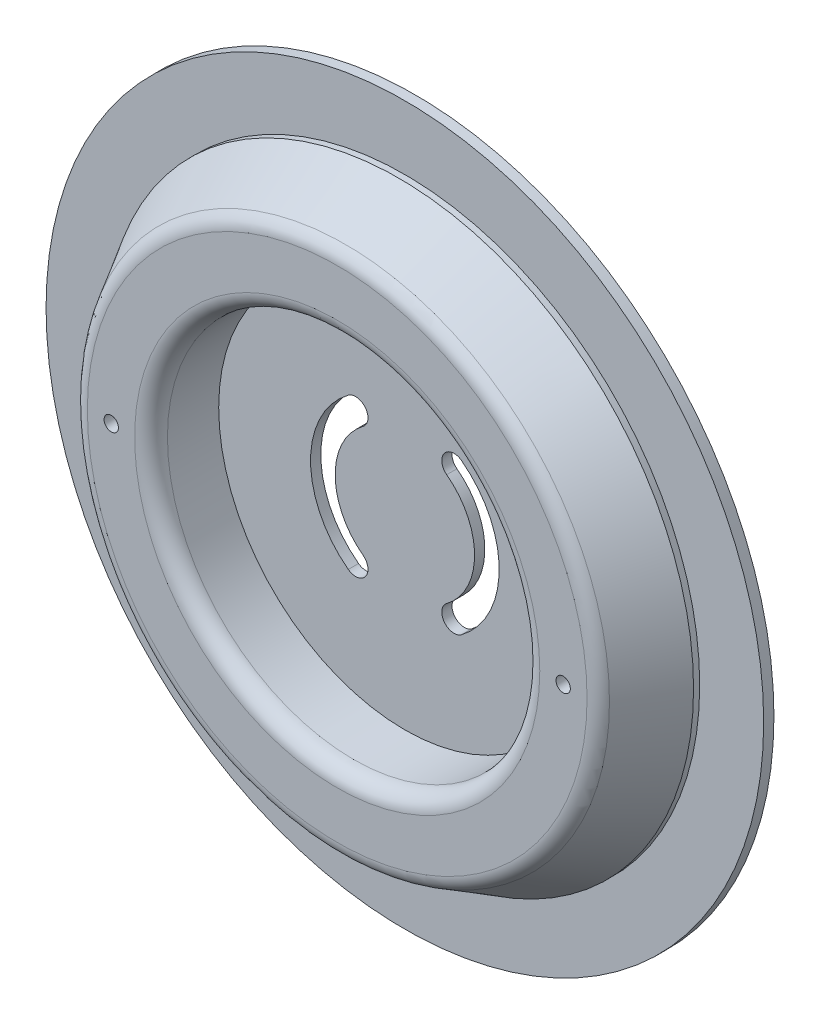
ISO-10303-21;
HEADER;
FILE_DESCRIPTION(('STEP AP214'),'2;1');
FILE_NAME('part.step','',(''),(''),'','','');
FILE_SCHEMA(('AUTOMOTIVE_DESIGN { 1 0 10303 214 1 1 1 1 }'));
ENDSEC;
DATA;
#1=APPLICATION_CONTEXT('core data for automotive mechanical design processes');
#2=APPLICATION_PROTOCOL_DEFINITION('international standard','automotive_design',2000,#1);
#3=PRODUCT_CONTEXT('',#1,'mechanical');
#4=PRODUCT('Part','Part','',(#3));
#5=PRODUCT_RELATED_PRODUCT_CATEGORY('part','',(#4));
#6=PRODUCT_DEFINITION_FORMATION('','',#4);
#7=PRODUCT_DEFINITION_CONTEXT('part definition',#1,'design');
#8=PRODUCT_DEFINITION('design','',#6,#7);
#9=PRODUCT_DEFINITION_SHAPE('','',#8);
#10=(LENGTH_UNIT() NAMED_UNIT(*) SI_UNIT(.MILLI.,.METRE.));
#11=(NAMED_UNIT(*) PLANE_ANGLE_UNIT() SI_UNIT($,.RADIAN.));
#12=(NAMED_UNIT(*) SI_UNIT($,.STERADIAN.) SOLID_ANGLE_UNIT());
#13=UNCERTAINTY_MEASURE_WITH_UNIT(LENGTH_MEASURE(1.E-05),#10,'distance_accuracy_value','');
#14=(GEOMETRIC_REPRESENTATION_CONTEXT(3) GLOBAL_UNCERTAINTY_ASSIGNED_CONTEXT((#13)) GLOBAL_UNIT_ASSIGNED_CONTEXT((#10,
#11,#12)) REPRESENTATION_CONTEXT('',''));
#15=CARTESIAN_POINT('',(0.,0.,0.));
#16=DIRECTION('',(0.,0.,1.));
#17=DIRECTION('',(1.,0.,0.));
#18=AXIS2_PLACEMENT_3D('',#15,#16,#17);
#19=CARTESIAN_POINT('',(0.,0.,-7.));
#20=DIRECTION('',(0.,0.,1.));
#21=DIRECTION('',(1.,0.,0.));
#22=AXIS2_PLACEMENT_3D('',#19,#20,#21);
#23=PLANE('',#22);
#24=CARTESIAN_POINT('',(12.,16.,-7.));
#25=DIRECTION('',(0.,0.,1.));
#26=DIRECTION('',(1.,0.,0.));
#27=AXIS2_PLACEMENT_3D('',#24,#25,#26);
#28=CIRCLE('',#27,3.);
#29=CARTESIAN_POINT('',(13.8,18.4,-7.));
#30=VERTEX_POINT('',#29);
#31=CARTESIAN_POINT('',(10.2,13.6,-7.));
#32=VERTEX_POINT('',#31);
#33=EDGE_CURVE('E199',#30,#32,#28,.T.);
#34=ORIENTED_EDGE('',*,*,#33,.F.);
#35=CARTESIAN_POINT('',(0.,0.,-7.));
#36=DIRECTION('',(0.,0.,1.));
#37=DIRECTION('',(1.,0.,0.));
#38=AXIS2_PLACEMENT_3D('',#35,#36,#37);
#39=CIRCLE('',#38,23.);
#40=CARTESIAN_POINT('',(13.8,-18.4,-7.));
#41=VERTEX_POINT('',#40);
#42=EDGE_CURVE('E182',#41,#30,#39,.T.);
#43=ORIENTED_EDGE('',*,*,#42,.F.);
#44=CARTESIAN_POINT('',(12.,-16.,-7.));
#45=DIRECTION('',(0.,0.,1.));
#46=DIRECTION('',(1.,0.,0.));
#47=AXIS2_PLACEMENT_3D('',#44,#45,#46);
#48=CIRCLE('',#47,3.);
#49=CARTESIAN_POINT('',(10.2,-13.6,-7.));
#50=VERTEX_POINT('',#49);
#51=EDGE_CURVE('E191',#50,#41,#48,.T.);
#52=ORIENTED_EDGE('',*,*,#51,.F.);
#53=CARTESIAN_POINT('',(0.,0.,-7.));
#54=DIRECTION('',(0.,0.,1.));
#55=DIRECTION('',(1.,0.,0.));
#56=AXIS2_PLACEMENT_3D('',#53,#54,#55);
#57=CIRCLE('',#56,17.);
#58=EDGE_CURVE('E197',#32,#50,#57,.F.);
#59=ORIENTED_EDGE('',*,*,#58,.F.);
#60=EDGE_LOOP('',(#34,#43,#52,#59));
#61=FACE_BOUND('',#60,.T.);
#62=CARTESIAN_POINT('',(0.,0.,-7.00000000000001));
#63=DIRECTION('',(0.,0.,1.));
#64=DIRECTION('',(1.,0.,0.));
#65=AXIS2_PLACEMENT_3D('',#62,#63,#64);
#66=CIRCLE('',#65,45.4);
#67=CARTESIAN_POINT('',(45.4,0.,-7.00000000000003));
#68=VERTEX_POINT('',#67);
#69=EDGE_CURVE('E229',#68,#68,#66,.F.);
#70=ORIENTED_EDGE('',*,*,#69,.F.);
#71=EDGE_LOOP('',(#70));
#72=FACE_BOUND('',#71,.T.);
#73=CARTESIAN_POINT('',(0.,0.,-7.));
#74=DIRECTION('',(0.,0.,1.));
#75=DIRECTION('',(1.,0.,0.));
#76=AXIS2_PLACEMENT_3D('',#73,#74,#75);
#77=CIRCLE('',#76,23.);
#78=CARTESIAN_POINT('',(-13.8,-18.4,-7.));
#79=VERTEX_POINT('',#78);
#80=CARTESIAN_POINT('',(-13.8,18.4,-7.));
#81=VERTEX_POINT('',#80);
#82=EDGE_CURVE('E152',#79,#81,#77,.F.);
#83=ORIENTED_EDGE('',*,*,#82,.T.);
#84=CARTESIAN_POINT('',(-12.,16.,-7.));
#85=DIRECTION('',(0.,0.,1.));
#86=DIRECTION('',(1.,0.,0.));
#87=AXIS2_PLACEMENT_3D('',#84,#85,#86);
#88=CIRCLE('',#87,3.);
#89=CARTESIAN_POINT('',(-10.2,13.6,-7.));
#90=VERTEX_POINT('',#89);
#91=EDGE_CURVE('E158',#81,#90,#88,.F.);
#92=ORIENTED_EDGE('',*,*,#91,.T.);
#93=CARTESIAN_POINT('',(0.,0.,-7.));
#94=DIRECTION('',(0.,0.,1.));
#95=DIRECTION('',(1.,0.,0.));
#96=AXIS2_PLACEMENT_3D('',#93,#94,#95);
#97=CIRCLE('',#96,17.);
#98=CARTESIAN_POINT('',(-10.2,-13.6,-7.));
#99=VERTEX_POINT('',#98);
#100=EDGE_CURVE('E144',#90,#99,#97,.T.);
#101=ORIENTED_EDGE('',*,*,#100,.T.);
#102=CARTESIAN_POINT('',(-12.,-16.,-7.));
#103=DIRECTION('',(0.,0.,1.));
#104=DIRECTION('',(1.,0.,0.));
#105=AXIS2_PLACEMENT_3D('',#102,#103,#104);
#106=CIRCLE('',#105,3.);
#107=EDGE_CURVE('E123',#99,#79,#106,.F.);
#108=ORIENTED_EDGE('',*,*,#107,.T.);
#109=EDGE_LOOP('',(#83,#92,#101,#108));
#110=FACE_BOUND('',#109,.T.);
#111=ADVANCED_FACE('F50',(#61,#72,#110),#23,.T.);
#112=CARTESIAN_POINT('',(0.,0.,-9.5));
#113=DIRECTION('',(0.,0.,1.));
#114=DIRECTION('',(1.,0.,0.));
#115=AXIS2_PLACEMENT_3D('',#112,#113,#114);
#116=PLANE('',#115);
#117=CARTESIAN_POINT('',(0.,0.,-9.50000000000001));
#118=DIRECTION('',(0.,0.,1.));
#119=DIRECTION('',(1.,0.,0.));
#120=AXIS2_PLACEMENT_3D('',#117,#118,#119);
#121=CIRCLE('',#120,47.9);
#122=CARTESIAN_POINT('',(47.9,0.,-9.50000000000004));
#123=VERTEX_POINT('',#122);
#124=EDGE_CURVE('E201',#123,#123,#121,.F.);
#125=ORIENTED_EDGE('',*,*,#124,.T.);
#126=EDGE_LOOP('',(#125));
#127=FACE_BOUND('',#126,.T.);
#128=CARTESIAN_POINT('',(0.,0.,-9.5));
#129=DIRECTION('',(0.,0.,-1.));
#130=DIRECTION('',(-1.,0.,0.));
#131=AXIS2_PLACEMENT_3D('',#128,#129,#130);
#132=CIRCLE('',#131,23.);
#133=CARTESIAN_POINT('',(13.8,18.4,-9.5));
#134=VERTEX_POINT('',#133);
#135=CARTESIAN_POINT('',(13.8,-18.4,-9.5));
#136=VERTEX_POINT('',#135);
#137=EDGE_CURVE('E164',#134,#136,#132,.T.);
#138=ORIENTED_EDGE('',*,*,#137,.F.);
#139=CARTESIAN_POINT('',(12.,16.,-9.5));
#140=DIRECTION('',(0.,0.,-1.));
#141=DIRECTION('',(-1.,0.,0.));
#142=AXIS2_PLACEMENT_3D('',#139,#140,#141);
#143=CIRCLE('',#142,3.);
#144=CARTESIAN_POINT('',(10.2,13.6,-9.5));
#145=VERTEX_POINT('',#144);
#146=EDGE_CURVE('E165',#145,#134,#143,.T.);
#147=ORIENTED_EDGE('',*,*,#146,.F.);
#148=CARTESIAN_POINT('',(0.,0.,-9.5));
#149=DIRECTION('',(0.,0.,1.));
#150=DIRECTION('',(-1.,0.,0.));
#151=AXIS2_PLACEMENT_3D('',#148,#149,#150);
#152=CIRCLE('',#151,17.);
#153=CARTESIAN_POINT('',(10.2,-13.6,-9.5));
#154=VERTEX_POINT('',#153);
#155=EDGE_CURVE('E174',#154,#145,#152,.T.);
#156=ORIENTED_EDGE('',*,*,#155,.F.);
#157=CARTESIAN_POINT('',(12.,-16.,-9.5));
#158=DIRECTION('',(0.,0.,-1.));
#159=DIRECTION('',(-1.,0.,0.));
#160=AXIS2_PLACEMENT_3D('',#157,#158,#159);
#161=CIRCLE('',#160,3.);
#162=EDGE_CURVE('E166',#136,#154,#161,.T.);
#163=ORIENTED_EDGE('',*,*,#162,.F.);
#164=EDGE_LOOP('',(#138,#147,#156,#163));
#165=FACE_BOUND('',#164,.T.);
#166=CARTESIAN_POINT('',(-12.,16.,-9.5));
#167=DIRECTION('',(0.,0.,1.));
#168=DIRECTION('',(1.,0.,0.));
#169=AXIS2_PLACEMENT_3D('',#166,#167,#168);
#170=CIRCLE('',#169,3.);
#171=CARTESIAN_POINT('',(-10.2,13.6,-9.5));
#172=VERTEX_POINT('',#171);
#173=CARTESIAN_POINT('',(-13.8,18.4,-9.5));
#174=VERTEX_POINT('',#173);
#175=EDGE_CURVE('E71',#172,#174,#170,.T.);
#176=ORIENTED_EDGE('',*,*,#175,.T.);
#177=CARTESIAN_POINT('',(0.,0.,-9.5));
#178=DIRECTION('',(0.,0.,1.));
#179=DIRECTION('',(1.,0.,0.));
#180=AXIS2_PLACEMENT_3D('',#177,#178,#179);
#181=CIRCLE('',#180,23.);
#182=CARTESIAN_POINT('',(-13.8,-18.4,-9.5));
#183=VERTEX_POINT('',#182);
#184=EDGE_CURVE('E135',#174,#183,#181,.T.);
#185=ORIENTED_EDGE('',*,*,#184,.T.);
#186=CARTESIAN_POINT('',(-12.,-16.,-9.5));
#187=DIRECTION('',(0.,0.,1.));
#188=DIRECTION('',(1.,0.,0.));
#189=AXIS2_PLACEMENT_3D('',#186,#187,#188);
#190=CIRCLE('',#189,3.);
#191=CARTESIAN_POINT('',(-10.2,-13.6,-9.5));
#192=VERTEX_POINT('',#191);
#193=EDGE_CURVE('E119',#183,#192,#190,.T.);
#194=ORIENTED_EDGE('',*,*,#193,.T.);
#195=CARTESIAN_POINT('',(0.,0.,-9.5));
#196=DIRECTION('',(0.,0.,-1.));
#197=DIRECTION('',(1.,0.,0.));
#198=AXIS2_PLACEMENT_3D('',#195,#196,#197);
#199=CIRCLE('',#198,17.);
#200=EDGE_CURVE('E126',#192,#172,#199,.T.);
#201=ORIENTED_EDGE('',*,*,#200,.T.);
#202=EDGE_LOOP('',(#176,#185,#194,#201));
#203=FACE_BOUND('',#202,.T.);
#204=ADVANCED_FACE('F134',(#127,#165,#203),#116,.F.);
#205=CARTESIAN_POINT('',(0.,0.,9.5));
#206=DIRECTION('',(0.,0.,-1.));
#207=DIRECTION('',(-1.,0.,0.));
#208=AXIS2_PLACEMENT_3D('',#205,#206,#207);
#209=CYLINDRICAL_SURFACE('',#208,87.5);
#210=CARTESIAN_POINT('',(0.,0.,-9.5));
#211=DIRECTION('',(0.,0.,1.));
#212=DIRECTION('',(1.,0.,0.));
#213=AXIS2_PLACEMENT_3D('',#210,#211,#212);
#214=CIRCLE('',#213,87.5);
#215=CARTESIAN_POINT('',(87.5,0.,-9.5));
#216=VERTEX_POINT('',#215);
#217=EDGE_CURVE('E244',#216,#216,#214,.T.);
#218=ORIENTED_EDGE('',*,*,#217,.T.);
#219=EDGE_LOOP('',(#218));
#220=FACE_BOUND('',#219,.T.);
#221=CARTESIAN_POINT('',(0.,0.,-7.));
#222=DIRECTION('',(0.,0.,1.));
#223=DIRECTION('',(1.,0.,0.));
#224=AXIS2_PLACEMENT_3D('',#221,#222,#223);
#225=CIRCLE('',#224,87.5);
#226=CARTESIAN_POINT('',(87.5,0.,-7.));
#227=VERTEX_POINT('',#226);
#228=EDGE_CURVE('E239',#227,#227,#225,.T.);
#229=ORIENTED_EDGE('',*,*,#228,.F.);
#230=EDGE_LOOP('',(#229));
#231=FACE_BOUND('',#230,.T.);
#232=ADVANCED_FACE('F320',(#220,#231),#209,.T.);
#233=CARTESIAN_POINT('',(0.,0.,-9.5));
#234=DIRECTION('',(0.,0.,1.));
#235=DIRECTION('',(1.,0.,0.));
#236=AXIS2_PLACEMENT_3D('',#233,#234,#235);
#237=PLANE('',#236);
#238=CARTESIAN_POINT('',(0.,0.,-9.5));
#239=DIRECTION('',(0.,0.,1.));
#240=DIRECTION('',(1.,0.,0.));
#241=AXIS2_PLACEMENT_3D('',#238,#239,#240);
#242=CIRCLE('',#241,69.4);
#243=CARTESIAN_POINT('',(69.4,0.,-9.5));
#244=VERTEX_POINT('',#243);
#245=EDGE_CURVE('E204',#244,#244,#242,.T.);
#246=ORIENTED_EDGE('',*,*,#245,.T.);
#247=EDGE_LOOP('',(#246));
#248=FACE_BOUND('',#247,.T.);
#249=ORIENTED_EDGE('',*,*,#217,.F.);
#250=EDGE_LOOP('',(#249));
#251=FACE_BOUND('',#250,.T.);
#252=ADVANCED_FACE('F368',(#248,#251),#237,.F.);
#253=CARTESIAN_POINT('',(0.,0.,-7.));
#254=DIRECTION('',(0.,0.,1.));
#255=DIRECTION('',(1.,0.,0.));
#256=AXIS2_PLACEMENT_3D('',#253,#254,#255);
#257=PLANE('',#256);
#258=CARTESIAN_POINT('',(0.,0.,-7.));
#259=DIRECTION('',(0.,0.,1.));
#260=DIRECTION('',(1.,0.,0.));
#261=AXIS2_PLACEMENT_3D('',#258,#259,#260);
#262=CIRCLE('',#261,71.9);
#263=CARTESIAN_POINT('',(71.9,0.,-7.));
#264=VERTEX_POINT('',#263);
#265=EDGE_CURVE('E232',#264,#264,#262,.T.);
#266=ORIENTED_EDGE('',*,*,#265,.F.);
#267=EDGE_LOOP('',(#266));
#268=FACE_BOUND('',#267,.T.);
#269=ORIENTED_EDGE('',*,*,#228,.T.);
#270=EDGE_LOOP('',(#269));
#271=FACE_BOUND('',#270,.T.);
#272=ADVANCED_FACE('F362',(#268,#271),#257,.T.);
#273=CARTESIAN_POINT('',(0.,0.,-7.));
#274=DIRECTION('',(0.,0.,1.));
#275=DIRECTION('',(1.,0.,0.));
#276=AXIS2_PLACEMENT_3D('',#273,#274,#275);
#277=CYLINDRICAL_SURFACE('',#276,71.9);
#278=CARTESIAN_POINT('',(0.,0.,-5.5000000000001));
#279=DIRECTION('',(0.,0.,1.));
#280=DIRECTION('',(1.,0.,0.));
#281=AXIS2_PLACEMENT_3D('',#278,#279,#280);
#282=CIRCLE('',#281,71.9);
#283=CARTESIAN_POINT('',(-71.9,0.,-5.5000000000001));
#284=VERTEX_POINT('',#283);
#285=EDGE_CURVE('E250',#284,#284,#282,.F.);
#286=ORIENTED_EDGE('',*,*,#285,.T.);
#287=EDGE_LOOP('',(#286));
#288=FACE_BOUND('',#287,.T.);
#289=ORIENTED_EDGE('',*,*,#265,.T.);
#290=EDGE_LOOP('',(#289));
#291=FACE_BOUND('',#290,.T.);
#292=ADVANCED_FACE('F359',(#288,#291),#277,.T.);
#293=CARTESIAN_POINT('',(0.,0.,9.5));
#294=DIRECTION('',(0.,0.,1.));
#295=DIRECTION('',(1.,0.,0.));
#296=AXIS2_PLACEMENT_3D('',#293,#294,#295);
#297=PLANE('',#296);
#298=CARTESIAN_POINT('',(55.1,0.,9.5));
#299=DIRECTION('',(0.,0.,-1.));
#300=DIRECTION('',(-1.,0.,0.));
#301=AXIS2_PLACEMENT_3D('',#298,#299,#300);
#302=CIRCLE('',#301,1.75);
#303=CARTESIAN_POINT('',(53.35,0.,9.5));
#304=VERTEX_POINT('',#303);
#305=EDGE_CURVE('E274',#304,#304,#302,.T.);
#306=ORIENTED_EDGE('',*,*,#305,.T.);
#307=EDGE_LOOP('',(#306));
#308=FACE_BOUND('',#307,.T.);
#309=CARTESIAN_POINT('',(-55.1,0.,9.5));
#310=DIRECTION('',(0.,0.,1.));
#311=DIRECTION('',(1.,0.,0.));
#312=AXIS2_PLACEMENT_3D('',#309,#310,#311);
#313=CIRCLE('',#312,1.75);
#314=CARTESIAN_POINT('',(-53.35,0.,9.5));
#315=VERTEX_POINT('',#314);
#316=EDGE_CURVE('E262',#315,#315,#313,.T.);
#317=ORIENTED_EDGE('',*,*,#316,.F.);
#318=EDGE_LOOP('',(#317));
#319=FACE_BOUND('',#318,.T.);
#320=CARTESIAN_POINT('',(0.,0.,9.5));
#321=DIRECTION('',(0.,0.,1.));
#322=DIRECTION('',(1.,0.,0.));
#323=AXIS2_PLACEMENT_3D('',#320,#321,#322);
#324=CIRCLE('',#323,60.9303448853971);
#325=CARTESIAN_POINT('',(60.9303448853971,0.,9.5));
#326=VERTEX_POINT('',#325);
#327=EDGE_CURVE('E254',#326,#326,#324,.T.);
#328=ORIENTED_EDGE('',*,*,#327,.T.);
#329=EDGE_LOOP('',(#328));
#330=FACE_BOUND('',#329,.T.);
#331=CARTESIAN_POINT('',(0.,0.,9.5));
#332=DIRECTION('',(0.,0.,1.));
#333=DIRECTION('',(1.,0.,0.));
#334=AXIS2_PLACEMENT_3D('',#331,#332,#333);
#335=CIRCLE('',#334,49.4);
#336=CARTESIAN_POINT('',(49.4,0.,9.5));
#337=VERTEX_POINT('',#336);
#338=EDGE_CURVE('E253',#337,#337,#335,.F.);
#339=ORIENTED_EDGE('',*,*,#338,.T.);
#340=EDGE_LOOP('',(#339));
#341=FACE_BOUND('',#340,.T.);
#342=ADVANCED_FACE('F281',(#308,#319,#330,#341),#297,.T.);
#343=CARTESIAN_POINT('',(0.,0.,-135.410591463477));
#344=DIRECTION('',(0.,0.,1.));
#345=DIRECTION('',(1.,0.,0.));
#346=AXIS2_PLACEMENT_3D('',#343,#344,#345);
#347=CYLINDRICAL_SURFACE('',#346,45.4);
#348=CARTESIAN_POINT('',(0.,0.,5.50000000000001));
#349=DIRECTION('',(0.,0.,1.));
#350=DIRECTION('',(1.,0.,0.));
#351=AXIS2_PLACEMENT_3D('',#348,#349,#350);
#352=CIRCLE('',#351,45.4);
#353=CARTESIAN_POINT('',(45.4,0.,5.49999999999998));
#354=VERTEX_POINT('',#353);
#355=EDGE_CURVE('E11',#354,#354,#352,.T.);
#356=CARTESIAN_POINT('',(45.4,0.,5.49999999999998));
#357=CARTESIAN_POINT('',(45.4,0.,5.36979166666664));
#358=CARTESIAN_POINT('',(45.4,0.,5.23958333333331));
#359=CARTESIAN_POINT('',(45.4,0.,4.97916666666664));
#360=CARTESIAN_POINT('',(45.4,0.,4.8489583333333));
#361=CARTESIAN_POINT('',(45.4,0.,4.58854166666664));
#362=CARTESIAN_POINT('',(45.4,0.,4.45833333333331));
#363=CARTESIAN_POINT('',(45.4,0.,4.19791666666665));
#364=CARTESIAN_POINT('',(45.4,0.,4.06770833333332));
#365=CARTESIAN_POINT('',(45.4,0.,3.80729166666665));
#366=CARTESIAN_POINT('',(45.4,0.,3.67708333333331));
#367=CARTESIAN_POINT('',(45.4,0.,3.41666666666664));
#368=CARTESIAN_POINT('',(45.4,0.,3.28645833333331));
#369=CARTESIAN_POINT('',(45.4,0.,3.02604166666664));
#370=CARTESIAN_POINT('',(45.4,0.,2.8958333333333));
#371=CARTESIAN_POINT('',(45.4,0.,2.63541666666664));
#372=CARTESIAN_POINT('',(45.4,0.,2.50520833333331));
#373=CARTESIAN_POINT('',(45.4,0.,2.24479166666665));
#374=CARTESIAN_POINT('',(45.4,0.,2.11458333333332));
#375=CARTESIAN_POINT('',(45.4,0.,1.85416666666665));
#376=CARTESIAN_POINT('',(45.4,0.,1.72395833333331));
#377=CARTESIAN_POINT('',(45.4,0.,1.46354166666664));
#378=CARTESIAN_POINT('',(45.4,0.,1.33333333333331));
#379=CARTESIAN_POINT('',(45.4,0.,1.07291666666664));
#380=CARTESIAN_POINT('',(45.4,0.,0.942708333333301));
#381=CARTESIAN_POINT('',(45.4,0.,0.682291666666631));
#382=CARTESIAN_POINT('',(45.4,0.,0.552083333333296));
#383=CARTESIAN_POINT('',(45.4,0.,0.291666666666635));
#384=CARTESIAN_POINT('',(45.4,0.,0.161458333333309));
#385=CARTESIAN_POINT('',(45.4,0.,-0.0989583333333525));
#386=CARTESIAN_POINT('',(45.4,0.,-0.229166666666688));
#387=CARTESIAN_POINT('',(45.4,0.,-0.489583333333358));
#388=CARTESIAN_POINT('',(45.4,0.,-0.619791666666693));
#389=CARTESIAN_POINT('',(45.4,0.,-0.880208333333364));
#390=CARTESIAN_POINT('',(45.4,0.,-1.0104166666667));
#391=CARTESIAN_POINT('',(45.4,0.,-1.27083333333337));
#392=CARTESIAN_POINT('',(45.4,0.,-1.4010416666667));
#393=CARTESIAN_POINT('',(45.4,0.,-1.66145833333337));
#394=CARTESIAN_POINT('',(45.4,0.,-1.79166666666669));
#395=CARTESIAN_POINT('',(45.4,0.,-2.05208333333335));
#396=CARTESIAN_POINT('',(45.4,0.,-2.18229166666669));
#397=CARTESIAN_POINT('',(45.4,0.,-2.44270833333336));
#398=CARTESIAN_POINT('',(45.4,0.,-2.57291666666669));
#399=CARTESIAN_POINT('',(45.4,0.,-2.83333333333336));
#400=CARTESIAN_POINT('',(45.4,0.,-2.9635416666667));
#401=CARTESIAN_POINT('',(45.4,0.,-3.22395833333337));
#402=CARTESIAN_POINT('',(45.4,0.,-3.3541666666667));
#403=CARTESIAN_POINT('',(45.4,0.,-3.61458333333337));
#404=CARTESIAN_POINT('',(45.4,0.,-3.74479166666671));
#405=CARTESIAN_POINT('',(45.4,0.,-4.00520833333337));
#406=CARTESIAN_POINT('',(45.4,0.,-4.1354166666667));
#407=CARTESIAN_POINT('',(45.4,0.,-4.39583333333336));
#408=CARTESIAN_POINT('',(45.4,0.,-4.52604166666669));
#409=CARTESIAN_POINT('',(45.4,0.,-4.78645833333336));
#410=CARTESIAN_POINT('',(45.4,0.,-4.9166666666667));
#411=CARTESIAN_POINT('',(45.4,0.,-5.17708333333337));
#412=CARTESIAN_POINT('',(45.4,0.,-5.3072916666667));
#413=CARTESIAN_POINT('',(45.4,0.,-5.56770833333337));
#414=CARTESIAN_POINT('',(45.4,0.,-5.69791666666671));
#415=CARTESIAN_POINT('',(45.4,0.,-5.95833333333337));
#416=CARTESIAN_POINT('',(45.4,0.,-6.0885416666667));
#417=CARTESIAN_POINT('',(45.4,0.,-6.34895833333336));
#418=CARTESIAN_POINT('',(45.4,0.,-6.47916666666669));
#419=CARTESIAN_POINT('',(45.4,0.,-6.73958333333336));
#420=CARTESIAN_POINT('',(45.4,0.,-6.8697916666667));
#421=CARTESIAN_POINT('',(45.4,0.,-7.00000000000003));
#422=B_SPLINE_CURVE_WITH_KNOTS('',3,(#356,#357,#358,#359,#360,#361,#362,#363,#364,#365,#366,
#367,#368,#369,#370,#371,#372,#373,#374,#375,#376,#377,#378,#379,#380,#381,#382,#383,#384,#385,
#386,#387,#388,#389,#390,#391,#392,#393,#394,#395,#396,#397,#398,#399,#400,#401,#402,#403,#404,
#405,#406,#407,#408,#409,#410,#411,#412,#413,#414,#415,#416,#417,#418,#419,#420,#421),
.UNSPECIFIED.,.F.,.F.,(4,2,2,2,2,2,2,2,2,2,2,2,2,2,2,2,2,2,2,2,2,2,2,2,2,2,2,2,2,2,2,2,4),(0.,
0.390625000000006,0.781250000000011,1.17187499999999,1.56249999999999,1.953125,2.34375000000001,
2.73437500000001,3.12499999999999,3.51562499999999,3.90625,4.29687500000001,4.68750000000001,
5.07812500000002,5.46874999999999,5.859375,6.25000000000001,6.64062500000001,7.03125000000002,
7.42187499999999,7.8125,8.20312500000001,8.59375000000001,8.98437500000002,9.37500000000002,
9.765625,10.15625,10.546875,10.9375,11.328125,11.71875,12.109375,12.5),.UNSPECIFIED.);
#423=EDGE_CURVE('BSEAM353',#354,#68,#422,.T.);
#424=ORIENTED_EDGE('',*,*,#355,.T.);
#425=ORIENTED_EDGE('',*,*,#69,.T.);
#426=ORIENTED_EDGE('',*,*,#423,.T.);
#427=ORIENTED_EDGE('',*,*,#423,.F.);
#428=EDGE_LOOP('',(#424,#426,#425,#427));
#429=FACE_BOUND('',#428,.T.);
#430=ADVANCED_FACE('F353',(#429),#347,.F.);
#431=CARTESIAN_POINT('',(0.,0.,9.5));
#432=DIRECTION('',(0.,0.,-1.));
#433=DIRECTION('',(-1.,0.,0.));
#434=AXIS2_PLACEMENT_3D('',#431,#432,#433);
#435=CONICAL_SURFACE('',#434,63.2397459621556,0.523598775598297);
#436=CARTESIAN_POINT('',(0.,0.,7.50000000000002));
#437=DIRECTION('',(0.,0.,1.));
#438=DIRECTION('',(1.,0.,0.));
#439=AXIS2_PLACEMENT_3D('',#436,#437,#438);
#440=CIRCLE('',#439,64.3944465005348);
#441=CARTESIAN_POINT('',(-64.3944465005348,0.,7.50000000000002));
#442=VERTEX_POINT('',#441);
#443=EDGE_CURVE('E60',#442,#442,#440,.F.);
#444=CARTESIAN_POINT('',(-64.3944465005348,0.,7.50000000000002));
#445=CARTESIAN_POINT('',(-64.4726293494876,0.,7.36458333333335));
#446=CARTESIAN_POINT('',(-64.5508121984403,0.,7.22916666666668));
#447=CARTESIAN_POINT('',(-64.7071778963459,0.,6.95833333333335));
#448=CARTESIAN_POINT('',(-64.7853607452986,0.,6.82291666666668));
#449=CARTESIAN_POINT('',(-64.9417264432042,0.,6.55208333333334));
#450=CARTESIAN_POINT('',(-65.0199092921569,0.,6.41666666666668));
#451=CARTESIAN_POINT('',(-65.1762749900625,0.,6.14583333333334));
#452=CARTESIAN_POINT('',(-65.2544578390152,0.,6.01041666666667));
#453=CARTESIAN_POINT('',(-65.4108235369207,0.,5.73958333333334));
#454=CARTESIAN_POINT('',(-65.4890063858735,0.,5.60416666666667));
#455=CARTESIAN_POINT('',(-65.645372083779,0.,5.33333333333333));
#456=CARTESIAN_POINT('',(-65.7235549327318,0.,5.19791666666667));
#457=CARTESIAN_POINT('',(-65.8799206306373,0.,4.92708333333333));
#458=CARTESIAN_POINT('',(-65.9581034795901,0.,4.79166666666666));
#459=CARTESIAN_POINT('',(-66.1144691774956,0.,4.52083333333333));
#460=CARTESIAN_POINT('',(-66.1926520264483,0.,4.38541666666666));
#461=CARTESIAN_POINT('',(-66.3490177243539,0.,4.11458333333332));
#462=CARTESIAN_POINT('',(-66.4272005733066,0.,3.97916666666665));
#463=CARTESIAN_POINT('',(-66.5835662712122,0.,3.70833333333332));
#464=CARTESIAN_POINT('',(-66.6617491201649,0.,3.57291666666665));
#465=CARTESIAN_POINT('',(-66.8181148180705,0.,3.30208333333331));
#466=CARTESIAN_POINT('',(-66.8962976670232,0.,3.16666666666665));
#467=CARTESIAN_POINT('',(-67.0526633649287,0.,2.89583333333331));
#468=CARTESIAN_POINT('',(-67.1308462138815,0.,2.76041666666664));
#469=CARTESIAN_POINT('',(-67.287211911787,0.,2.48958333333331));
#470=CARTESIAN_POINT('',(-67.3653947607398,0.,2.35416666666664));
#471=CARTESIAN_POINT('',(-67.5217604586453,0.,2.0833333333333));
#472=CARTESIAN_POINT('',(-67.5999433075981,0.,1.94791666666664));
#473=CARTESIAN_POINT('',(-67.7563090055036,0.,1.6770833333333));
#474=CARTESIAN_POINT('',(-67.8344918544563,0.,1.54166666666663));
#475=CARTESIAN_POINT('',(-67.9908575523619,0.,1.2708333333333));
#476=CARTESIAN_POINT('',(-68.0690404013147,0.,1.13541666666663));
#477=CARTESIAN_POINT('',(-68.2254060992202,0.,0.864583333333296));
#478=CARTESIAN_POINT('',(-68.3035889481729,0.,0.729166666666626));
#479=CARTESIAN_POINT('',(-68.4599546460785,0.,0.45833333333329));
#480=CARTESIAN_POINT('',(-68.5381374950312,0.,0.322916666666624));
#481=CARTESIAN_POINT('',(-68.6945031929368,0.,0.0520833333332885));
#482=CARTESIAN_POINT('',(-68.7726860418895,0.,-0.0833333333333805));
#483=CARTESIAN_POINT('',(-68.929051739795,0.,-0.354166666666717));
#484=CARTESIAN_POINT('',(-69.0072345887478,0.,-0.489583333333384));
#485=CARTESIAN_POINT('',(-69.1636002866533,0.,-0.760416666666721));
#486=CARTESIAN_POINT('',(-69.2417831356061,0.,-0.89583333333339));
#487=CARTESIAN_POINT('',(-69.3981488335116,0.,-1.16666666666673));
#488=CARTESIAN_POINT('',(-69.4763316824644,0.,-1.30208333333339));
#489=CARTESIAN_POINT('',(-69.6326973803699,0.,-1.57291666666673));
#490=CARTESIAN_POINT('',(-69.7108802293226,0.,-1.7083333333334));
#491=CARTESIAN_POINT('',(-69.8672459272282,0.,-1.97916666666673));
#492=CARTESIAN_POINT('',(-69.9454287761809,0.,-2.1145833333334));
#493=CARTESIAN_POINT('',(-70.1017944740865,0.,-2.38541666666673));
#494=CARTESIAN_POINT('',(-70.1799773230392,0.,-2.5208333333334));
#495=CARTESIAN_POINT('',(-70.3363430209448,0.,-2.79166666666674));
#496=CARTESIAN_POINT('',(-70.4145258698975,0.,-2.92708333333341));
#497=CARTESIAN_POINT('',(-70.570891567803,0.,-3.19791666666674));
#498=CARTESIAN_POINT('',(-70.6490744167558,0.,-3.33333333333341));
#499=CARTESIAN_POINT('',(-70.8054401146613,0.,-3.60416666666675));
#500=CARTESIAN_POINT('',(-70.8836229636141,0.,-3.73958333333341));
#501=CARTESIAN_POINT('',(-71.0399886615196,0.,-4.01041666666675));
#502=CARTESIAN_POINT('',(-71.1181715104724,0.,-4.14583333333342));
#503=CARTESIAN_POINT('',(-71.2745372083779,0.,-4.41666666666676));
#504=CARTESIAN_POINT('',(-71.3527200573307,0.,-4.55208333333342));
#505=CARTESIAN_POINT('',(-71.5090857552362,0.,-4.82291666666676));
#506=CARTESIAN_POINT('',(-71.5872686041889,0.,-4.95833333333343));
#507=CARTESIAN_POINT('',(-71.7436343020945,0.,-5.22916666666676));
#508=CARTESIAN_POINT('',(-71.8218171510472,0.,-5.36458333333343));
#509=CARTESIAN_POINT('',(-71.9,0.,-5.5000000000001));
#510=B_SPLINE_CURVE_WITH_KNOTS('',3,(#444,#445,#446,#447,#448,#449,#450,#451,#452,#453,#454,
#455,#456,#457,#458,#459,#460,#461,#462,#463,#464,#465,#466,#467,#468,#469,#470,#471,#472,#473,
#474,#475,#476,#477,#478,#479,#480,#481,#482,#483,#484,#485,#486,#487,#488,#489,#490,#491,#492,
#493,#494,#495,#496,#497,#498,#499,#500,#501,#502,#503,#504,#505,#506,#507,#508,#509),
.UNSPECIFIED.,.F.,.F.,(4,2,2,2,2,2,2,2,2,2,2,2,2,2,2,2,2,2,2,2,2,2,2,2,2,2,2,2,2,2,2,2,4),(0.,
0.469097093716572,0.938194187433145,1.40729128114972,1.8763883748663,2.34548546858287,
2.81458256229945,3.28367965601602,3.75277674973259,4.22187384344917,4.69097093716575,
5.16006803088232,5.6291651245989,6.09826221831547,6.56735931203204,7.03645640574861,
7.50555349946519,7.97465059318176,8.44374768689834,8.91284478061492,9.38194187433149,
9.85103896804806,10.3201360617646,10.7892331554812,11.2583302491978,11.7274273429144,
12.1965244366309,12.6656215303475,13.1347186240641,13.6038157177807,14.0729128114972,
14.5420099052138,15.0111069989304),.UNSPECIFIED.);
#511=EDGE_CURVE('BSEAM360',#442,#284,#510,.T.);
#512=ORIENTED_EDGE('',*,*,#443,.T.);
#513=ORIENTED_EDGE('',*,*,#285,.F.);
#514=ORIENTED_EDGE('',*,*,#511,.T.);
#515=ORIENTED_EDGE('',*,*,#511,.F.);
#516=EDGE_LOOP('',(#512,#514,#513,#515));
#517=FACE_BOUND('',#516,.T.);
#518=ADVANCED_FACE('F360',(#517),#435,.T.);
#519=CARTESIAN_POINT('',(0.,0.,5.5));
#520=DIRECTION('',(0.,0.,1.));
#521=DIRECTION('',(1.,0.,0.));
#522=AXIS2_PLACEMENT_3D('',#519,#520,#521);
#523=TOROIDAL_SURFACE('',#522,60.9303448853971,4.);
#524=ORIENTED_EDGE('',*,*,#443,.F.);
#525=EDGE_LOOP('',(#524));
#526=FACE_BOUND('',#525,.T.);
#527=ORIENTED_EDGE('',*,*,#327,.F.);
#528=EDGE_LOOP('',(#527));
#529=FACE_BOUND('',#528,.T.);
#530=ADVANCED_FACE('F379',(#526,#529),#523,.T.);
#531=CARTESIAN_POINT('',(0.,0.,5.50000000000001));
#532=DIRECTION('',(0.,0.,1.));
#533=DIRECTION('',(1.,0.,0.));
#534=AXIS2_PLACEMENT_3D('',#531,#532,#533);
#535=TOROIDAL_SURFACE('',#534,49.4,4.);
#536=ORIENTED_EDGE('',*,*,#338,.F.);
#537=EDGE_LOOP('',(#536));
#538=FACE_BOUND('',#537,.T.);
#539=ORIENTED_EDGE('',*,*,#355,.F.);
#540=EDGE_LOOP('',(#539));
#541=FACE_BOUND('',#540,.T.);
#542=ADVANCED_FACE('F47',(#538,#541),#535,.T.);
#543=CARTESIAN_POINT('',(0.,0.,-7.));
#544=DIRECTION('',(0.,0.,1.));
#545=DIRECTION('',(1.,0.,0.));
#546=AXIS2_PLACEMENT_3D('',#543,#544,#545);
#547=CYLINDRICAL_SURFACE('',#546,69.4);
#548=CARTESIAN_POINT('',(0.,0.,-6.1698729810779));
#549=DIRECTION('',(0.,0.,-1.));
#550=DIRECTION('',(-1.,0.,0.));
#551=AXIS2_PLACEMENT_3D('',#548,#549,#550);
#552=CIRCLE('',#551,69.4);
#553=CARTESIAN_POINT('',(-69.4,0.,-6.1698729810779));
#554=VERTEX_POINT('',#553);
#555=EDGE_CURVE('E208',#554,#554,#552,.T.);
#556=ORIENTED_EDGE('',*,*,#555,.F.);
#557=EDGE_LOOP('',(#556));
#558=FACE_BOUND('',#557,.T.);
#559=ORIENTED_EDGE('',*,*,#245,.F.);
#560=EDGE_LOOP('',(#559));
#561=FACE_BOUND('',#560,.T.);
#562=ADVANCED_FACE('F294',(#558,#561),#547,.F.);
#563=CARTESIAN_POINT('',(0.,0.,7.));
#564=DIRECTION('',(0.,0.,1.));
#565=DIRECTION('',(1.,0.,0.));
#566=AXIS2_PLACEMENT_3D('',#563,#564,#565);
#567=PLANE('',#566);
#568=CARTESIAN_POINT('',(55.1,0.,7.));
#569=DIRECTION('',(0.,0.,1.));
#570=DIRECTION('',(1.,0.,0.));
#571=AXIS2_PLACEMENT_3D('',#568,#569,#570);
#572=CIRCLE('',#571,1.75);
#573=CARTESIAN_POINT('',(56.85,0.,7.));
#574=VERTEX_POINT('',#573);
#575=EDGE_CURVE('E51',#574,#574,#572,.F.);
#576=ORIENTED_EDGE('',*,*,#575,.F.);
#577=EDGE_LOOP('',(#576));
#578=FACE_BOUND('',#577,.T.);
#579=CARTESIAN_POINT('',(-55.1,0.,7.));
#580=DIRECTION('',(0.,0.,1.));
#581=DIRECTION('',(1.,0.,0.));
#582=AXIS2_PLACEMENT_3D('',#579,#580,#581);
#583=CIRCLE('',#582,1.75);
#584=CARTESIAN_POINT('',(-53.35,0.,7.));
#585=VERTEX_POINT('',#584);
#586=EDGE_CURVE('E261',#585,#585,#583,.T.);
#587=ORIENTED_EDGE('',*,*,#586,.T.);
#588=EDGE_LOOP('',(#587));
#589=FACE_BOUND('',#588,.T.);
#590=CARTESIAN_POINT('',(0.,0.,7.));
#591=DIRECTION('',(0.,0.,1.));
#592=DIRECTION('',(1.,0.,0.));
#593=AXIS2_PLACEMENT_3D('',#590,#591,#592);
#594=CIRCLE('',#593,60.9303448853971);
#595=CARTESIAN_POINT('',(60.9303448853971,0.,7.));
#596=VERTEX_POINT('',#595);
#597=EDGE_CURVE('E217',#596,#596,#594,.T.);
#598=ORIENTED_EDGE('',*,*,#597,.F.);
#599=EDGE_LOOP('',(#598));
#600=FACE_BOUND('',#599,.T.);
#601=CARTESIAN_POINT('',(0.,0.,7.));
#602=DIRECTION('',(0.,0.,1.));
#603=DIRECTION('',(1.,0.,0.));
#604=AXIS2_PLACEMENT_3D('',#601,#602,#603);
#605=CIRCLE('',#604,49.4);
#606=CARTESIAN_POINT('',(49.4,0.,7.));
#607=VERTEX_POINT('',#606);
#608=EDGE_CURVE('E215',#607,#607,#605,.F.);
#609=ORIENTED_EDGE('',*,*,#608,.F.);
#610=EDGE_LOOP('',(#609));
#611=FACE_BOUND('',#610,.T.);
#612=ADVANCED_FACE('F292',(#578,#589,#600,#611),#567,.F.);
#613=CARTESIAN_POINT('',(0.,0.,-135.410591463477));
#614=DIRECTION('',(0.,0.,1.));
#615=DIRECTION('',(1.,0.,0.));
#616=AXIS2_PLACEMENT_3D('',#613,#614,#615);
#617=CYLINDRICAL_SURFACE('',#616,47.9);
#618=CARTESIAN_POINT('',(0.,0.,5.49999999999995));
#619=DIRECTION('',(0.,0.,1.));
#620=DIRECTION('',(1.,0.,0.));
#621=AXIS2_PLACEMENT_3D('',#618,#619,#620);
#622=CIRCLE('',#621,47.9);
#623=CARTESIAN_POINT('',(47.9,0.,5.49999999999992));
#624=VERTEX_POINT('',#623);
#625=EDGE_CURVE('E220',#624,#624,#622,.T.);
#626=CARTESIAN_POINT('',(47.9,0.,5.49999999999992));
#627=CARTESIAN_POINT('',(47.9,0.,5.34374999999993));
#628=CARTESIAN_POINT('',(47.9,0.,5.18749999999993));
#629=CARTESIAN_POINT('',(47.9,0.,4.87499999999993));
#630=CARTESIAN_POINT('',(47.9,0.,4.71874999999992));
#631=CARTESIAN_POINT('',(47.9,0.,4.40624999999992));
#632=CARTESIAN_POINT('',(47.9,0.,4.24999999999992));
#633=CARTESIAN_POINT('',(47.9,0.,3.93749999999993));
#634=CARTESIAN_POINT('',(47.9,0.,3.78124999999993));
#635=CARTESIAN_POINT('',(47.9,0.,3.46874999999993));
#636=CARTESIAN_POINT('',(47.9,0.,3.31249999999992));
#637=CARTESIAN_POINT('',(47.9,0.,2.99999999999992));
#638=CARTESIAN_POINT('',(47.9,0.,2.84374999999992));
#639=CARTESIAN_POINT('',(47.9,0.,2.53124999999993));
#640=CARTESIAN_POINT('',(47.9,0.,2.37499999999993));
#641=CARTESIAN_POINT('',(47.9,0.,2.06249999999994));
#642=CARTESIAN_POINT('',(47.9,0.,1.90624999999994));
#643=CARTESIAN_POINT('',(47.9,0.,1.59374999999994));
#644=CARTESIAN_POINT('',(47.9,0.,1.43749999999993));
#645=CARTESIAN_POINT('',(47.9,0.,1.12499999999993));
#646=CARTESIAN_POINT('',(47.9,0.,0.968749999999935));
#647=CARTESIAN_POINT('',(47.9,0.,0.656249999999942));
#648=CARTESIAN_POINT('',(47.9,0.,0.499999999999945));
#649=CARTESIAN_POINT('',(47.9,0.,0.187499999999942));
#650=CARTESIAN_POINT('',(47.9,0.,0.0312499999999364));
#651=CARTESIAN_POINT('',(47.9,0.,-0.281250000000066));
#652=CARTESIAN_POINT('',(47.9,0.,-0.437500000000063));
#653=CARTESIAN_POINT('',(47.9,0.,-0.750000000000056));
#654=CARTESIAN_POINT('',(47.9,0.,-0.906250000000053));
#655=CARTESIAN_POINT('',(47.9,0.,-1.21875000000006));
#656=CARTESIAN_POINT('',(47.9,0.,-1.37500000000006));
#657=CARTESIAN_POINT('',(47.9,0.,-1.68750000000006));
#658=CARTESIAN_POINT('',(47.9,0.,-1.84375000000006));
#659=CARTESIAN_POINT('',(47.9,0.,-2.15625000000005));
#660=CARTESIAN_POINT('',(47.9,0.,-2.31250000000005));
#661=CARTESIAN_POINT('',(47.9,0.,-2.62500000000005));
#662=CARTESIAN_POINT('',(47.9,0.,-2.78125000000006));
#663=CARTESIAN_POINT('',(47.9,0.,-3.09375000000006));
#664=CARTESIAN_POINT('',(47.9,0.,-3.25000000000006));
#665=CARTESIAN_POINT('',(47.9,0.,-3.56250000000005));
#666=CARTESIAN_POINT('',(47.9,0.,-3.71875000000005));
#667=CARTESIAN_POINT('',(47.9,0.,-4.03125000000005));
#668=CARTESIAN_POINT('',(47.9,0.,-4.18750000000006));
#669=CARTESIAN_POINT('',(47.9,0.,-4.50000000000006));
#670=CARTESIAN_POINT('',(47.9,0.,-4.65625000000006));
#671=CARTESIAN_POINT('',(47.9,0.,-4.96875000000005));
#672=CARTESIAN_POINT('',(47.9,0.,-5.12500000000005));
#673=CARTESIAN_POINT('',(47.9,0.,-5.43750000000005));
#674=CARTESIAN_POINT('',(47.9,0.,-5.59375000000005));
#675=CARTESIAN_POINT('',(47.9,0.,-5.90625000000006));
#676=CARTESIAN_POINT('',(47.9,0.,-6.06250000000005));
#677=CARTESIAN_POINT('',(47.9,0.,-6.37500000000005));
#678=CARTESIAN_POINT('',(47.9,0.,-6.53125000000004));
#679=CARTESIAN_POINT('',(47.9,0.,-6.84375000000004));
#680=CARTESIAN_POINT('',(47.9,0.,-7.00000000000003));
#681=CARTESIAN_POINT('',(47.9,0.,-7.31250000000004));
#682=CARTESIAN_POINT('',(47.9,0.,-7.46875000000004));
#683=CARTESIAN_POINT('',(47.9,0.,-7.78125000000005));
#684=CARTESIAN_POINT('',(47.9,0.,-7.93750000000004));
#685=CARTESIAN_POINT('',(47.9,0.,-8.25000000000004));
#686=CARTESIAN_POINT('',(47.9,0.,-8.40625000000003));
#687=CARTESIAN_POINT('',(47.9,0.,-8.71875000000003));
#688=CARTESIAN_POINT('',(47.9,0.,-8.87500000000004));
#689=CARTESIAN_POINT('',(47.9,0.,-9.18750000000004));
#690=CARTESIAN_POINT('',(47.9,0.,-9.34375000000004));
#691=CARTESIAN_POINT('',(47.9,0.,-9.50000000000004));
#692=B_SPLINE_CURVE_WITH_KNOTS('',3,(#626,#627,#628,#629,#630,#631,#632,#633,#634,#635,#636,
#637,#638,#639,#640,#641,#642,#643,#644,#645,#646,#647,#648,#649,#650,#651,#652,#653,#654,#655,
#656,#657,#658,#659,#660,#661,#662,#663,#664,#665,#666,#667,#668,#669,#670,#671,#672,#673,#674,
#675,#676,#677,#678,#679,#680,#681,#682,#683,#684,#685,#686,#687,#688,#689,#690,#691),
.UNSPECIFIED.,.F.,.F.,(4,2,2,2,2,2,2,2,2,2,2,2,2,2,2,2,2,2,2,2,2,2,2,2,2,2,2,2,2,2,2,2,4),(0.,
0.46874999999999,0.937500000000008,1.40625,1.87499999999999,2.34375000000001,2.8125,
3.28124999999999,3.74999999999998,4.21874999999999,4.68749999999998,5.15624999999997,
5.62499999999999,6.09374999999998,6.56249999999997,7.03124999999999,7.49999999999998,
7.96874999999997,8.43749999999999,8.90624999999998,9.37499999999997,9.84374999999998,10.3125,
10.78125,11.25,11.71875,12.1875,12.65625,13.125,13.59375,14.0625,14.53125,15.),.UNSPECIFIED.);
#693=EDGE_CURVE('BSEAM291',#624,#123,#692,.T.);
#694=ORIENTED_EDGE('',*,*,#625,.F.);
#695=ORIENTED_EDGE('',*,*,#124,.F.);
#696=ORIENTED_EDGE('',*,*,#693,.T.);
#697=ORIENTED_EDGE('',*,*,#693,.F.);
#698=EDGE_LOOP('',(#694,#696,#695,#697));
#699=FACE_BOUND('',#698,.T.);
#700=ADVANCED_FACE('F291',(#699),#617,.T.);
#701=CARTESIAN_POINT('',(0.,0.,8.25));
#702=DIRECTION('',(0.,0.,-1.));
#703=DIRECTION('',(-1.,0.,0.));
#704=AXIS2_PLACEMENT_3D('',#701,#702,#703);
#705=CONICAL_SURFACE('',#704,61.0746824526945,0.523598775598297);
#706=CARTESIAN_POINT('',(0.,0.,6.25000000000003));
#707=DIRECTION('',(0.,0.,-1.));
#708=DIRECTION('',(-1.,0.,0.));
#709=AXIS2_PLACEMENT_3D('',#706,#707,#708);
#710=CIRCLE('',#709,62.2293829910737);
#711=CARTESIAN_POINT('',(-62.2293829910737,0.,6.25000000000003));
#712=VERTEX_POINT('',#711);
#713=EDGE_CURVE('E213',#712,#712,#710,.T.);
#714=CARTESIAN_POINT('',(-62.2293829910737,0.,6.25000000000003));
#715=CARTESIAN_POINT('',(-62.30407691825,0.,6.1206263231138));
#716=CARTESIAN_POINT('',(-62.3787708454264,0.,5.99125264622757));
#717=CARTESIAN_POINT('',(-62.528158699779,0.,5.73250529245511));
#718=CARTESIAN_POINT('',(-62.6028526269553,0.,5.60313161556889));
#719=CARTESIAN_POINT('',(-62.7522404813079,0.,5.34438426179643));
#720=CARTESIAN_POINT('',(-62.8269344084842,0.,5.2150105849102));
#721=CARTESIAN_POINT('',(-62.9763222628369,0.,4.95626323113774));
#722=CARTESIAN_POINT('',(-63.0510161900132,0.,4.82688955425152));
#723=CARTESIAN_POINT('',(-63.2004040443658,0.,4.56814220047906));
#724=CARTESIAN_POINT('',(-63.2750979715421,0.,4.43876852359283));
#725=CARTESIAN_POINT('',(-63.4244858258948,0.,4.18002116982037));
#726=CARTESIAN_POINT('',(-63.4991797530711,0.,4.05064749293414));
#727=CARTESIAN_POINT('',(-63.6485676074237,0.,3.79190013916169));
#728=CARTESIAN_POINT('',(-63.7232615346,0.,3.66252646227546));
#729=CARTESIAN_POINT('',(-63.8726493889527,0.,3.403779108503));
#730=CARTESIAN_POINT('',(-63.947343316129,0.,3.27440543161677));
#731=CARTESIAN_POINT('',(-64.0967311704816,0.,3.01565807784432));
#732=CARTESIAN_POINT('',(-64.1714250976579,0.,2.88628440095809));
#733=CARTESIAN_POINT('',(-64.3208129520105,0.,2.62753704718563));
#734=CARTESIAN_POINT('',(-64.3955068791869,0.,2.4981633702994));
#735=CARTESIAN_POINT('',(-64.5448947335395,0.,2.23941601652695));
#736=CARTESIAN_POINT('',(-64.6195886607158,0.,2.11004233964072));
#737=CARTESIAN_POINT('',(-64.7689765150684,0.,1.85129498586826));
#738=CARTESIAN_POINT('',(-64.8436704422448,0.,1.72192130898203));
#739=CARTESIAN_POINT('',(-64.9930582965974,0.,1.46317395520957));
#740=CARTESIAN_POINT('',(-65.0677522237737,0.,1.33380027832335));
#741=CARTESIAN_POINT('',(-65.2171400781263,0.,1.07505292455089));
#742=CARTESIAN_POINT('',(-65.2918340053027,0.,0.945679247664661));
#743=CARTESIAN_POINT('',(-65.4412218596553,0.,0.686931893892205));
#744=CARTESIAN_POINT('',(-65.5159157868316,0.,0.55755821700598));
#745=CARTESIAN_POINT('',(-65.6653036411842,0.,0.298810863233524));
#746=CARTESIAN_POINT('',(-65.7399975683606,0.,0.169437186347293));
#747=CARTESIAN_POINT('',(-65.8893854227132,0.,-0.0893101674251644));
#748=CARTESIAN_POINT('',(-65.9640793498895,0.,-0.218683844311391));
#749=CARTESIAN_POINT('',(-66.1134672042421,0.,-0.477431198083847));
#750=CARTESIAN_POINT('',(-66.1881611314184,0.,-0.606804874970077));
#751=CARTESIAN_POINT('',(-66.3375489857711,0.,-0.865552228742535));
#752=CARTESIAN_POINT('',(-66.4122429129474,0.,-0.994925905628764));
#753=CARTESIAN_POINT('',(-66.5616307673,0.,-1.25367325940122));
#754=CARTESIAN_POINT('',(-66.6363246944763,0.,-1.38304693628745));
#755=CARTESIAN_POINT('',(-66.785712548829,0.,-1.6417942900599));
#756=CARTESIAN_POINT('',(-66.8604064760053,0.,-1.77116796694614));
#757=CARTESIAN_POINT('',(-67.0097943303579,0.,-2.02991532071859));
#758=CARTESIAN_POINT('',(-67.0844882575342,0.,-2.15928899760482));
#759=CARTESIAN_POINT('',(-67.2338761118869,0.,-2.41803635137727));
#760=CARTESIAN_POINT('',(-67.3085700390632,0.,-2.5474100282635));
#761=CARTESIAN_POINT('',(-67.4579578934158,0.,-2.80615738203596));
#762=CARTESIAN_POINT('',(-67.5326518205921,0.,-2.93553105892219));
#763=CARTESIAN_POINT('',(-67.6820396749447,0.,-3.19427841269465));
#764=CARTESIAN_POINT('',(-67.756733602121,0.,-3.32365208958087));
#765=CARTESIAN_POINT('',(-67.9061214564737,0.,-3.58239944335333));
#766=CARTESIAN_POINT('',(-67.98081538365,0.,-3.71177312023956));
#767=CARTESIAN_POINT('',(-68.1302032380026,0.,-3.97052047401202));
#768=CARTESIAN_POINT('',(-68.2048971651789,0.,-4.09989415089824));
#769=CARTESIAN_POINT('',(-68.3542850195316,0.,-4.3586415046707));
#770=CARTESIAN_POINT('',(-68.4289789467079,0.,-4.48801518155693));
#771=CARTESIAN_POINT('',(-68.5783668010605,0.,-4.74676253532939));
#772=CARTESIAN_POINT('',(-68.6530607282368,0.,-4.87613621221561));
#773=CARTESIAN_POINT('',(-68.8024485825895,0.,-5.13488356598807));
#774=CARTESIAN_POINT('',(-68.8771425097658,0.,-5.2642572428743));
#775=CARTESIAN_POINT('',(-69.0265303641184,0.,-5.52300459664676));
#776=CARTESIAN_POINT('',(-69.1012242912947,0.,-5.65237827353298));
#777=CARTESIAN_POINT('',(-69.2506121456474,0.,-5.91112562730544));
#778=CARTESIAN_POINT('',(-69.3253060728237,0.,-6.04049930419167));
#779=CARTESIAN_POINT('',(-69.4,0.,-6.1698729810779));
#780=B_SPLINE_CURVE_WITH_KNOTS('',3,(#714,#715,#716,#717,#718,#719,#720,#721,#722,#723,#724,
#725,#726,#727,#728,#729,#730,#731,#732,#733,#734,#735,#736,#737,#738,#739,#740,#741,#742,#743,
#744,#745,#746,#747,#748,#749,#750,#751,#752,#753,#754,#755,#756,#757,#758,#759,#760,#761,#762,
#763,#764,#765,#766,#767,#768,#769,#770,#771,#772,#773,#774,#775,#776,#777,#778,#779),
.UNSPECIFIED.,.F.,.F.,(4,2,2,2,2,2,2,2,2,2,2,2,2,2,2,2,2,2,2,2,2,2,2,2,2,2,2,2,2,2,2,2,4),(0.,
0.448163563057894,0.896327126115788,1.34449068917368,1.79265425223157,2.24081781528946,
2.68898137834736,3.13714494140525,3.58530850446315,4.03347206752104,4.48163563057893,
4.92979919363683,5.37796275669472,5.82612631975262,6.27428988281051,6.7224534458684,
7.17061700892629,7.61878057198419,8.06694413504208,8.51510769809997,8.96327126115787,
9.41143482421576,9.85959838727365,10.3077619503315,10.7559255133894,11.2040890764473,
11.6522526395052,12.1004162025631,12.548579765621,12.9967433286789,13.4449068917368,
13.8930704547947,14.3412340178526),.UNSPECIFIED.);
#781=EDGE_CURVE('BSEAM313',#712,#554,#780,.T.);
#782=ORIENTED_EDGE('',*,*,#713,.F.);
#783=ORIENTED_EDGE('',*,*,#555,.T.);
#784=ORIENTED_EDGE('',*,*,#781,.T.);
#785=ORIENTED_EDGE('',*,*,#781,.F.);
#786=EDGE_LOOP('',(#782,#784,#783,#785));
#787=FACE_BOUND('',#786,.T.);
#788=ADVANCED_FACE('F313',(#787),#705,.F.);
#789=CARTESIAN_POINT('',(0.,0.,5.5));
#790=DIRECTION('',(0.,0.,1.));
#791=DIRECTION('',(1.,0.,0.));
#792=AXIS2_PLACEMENT_3D('',#789,#790,#791);
#793=TOROIDAL_SURFACE('',#792,60.9303448853971,1.5);
#794=ORIENTED_EDGE('',*,*,#713,.T.);
#795=EDGE_LOOP('',(#794));
#796=FACE_BOUND('',#795,.T.);
#797=ORIENTED_EDGE('',*,*,#597,.T.);
#798=EDGE_LOOP('',(#797));
#799=FACE_BOUND('',#798,.T.);
#800=ADVANCED_FACE('F302',(#796,#799),#793,.F.);
#801=CARTESIAN_POINT('',(0.,0.,5.50000000000001));
#802=DIRECTION('',(0.,0.,1.));
#803=DIRECTION('',(1.,0.,0.));
#804=AXIS2_PLACEMENT_3D('',#801,#802,#803);
#805=TOROIDAL_SURFACE('',#804,49.4,1.5);
#806=ORIENTED_EDGE('',*,*,#608,.T.);
#807=EDGE_LOOP('',(#806));
#808=FACE_BOUND('',#807,.T.);
#809=ORIENTED_EDGE('',*,*,#625,.T.);
#810=EDGE_LOOP('',(#809));
#811=FACE_BOUND('',#810,.T.);
#812=ADVANCED_FACE('F303',(#808,#811),#805,.F.);
#813=CARTESIAN_POINT('',(12.,16.,9.5));
#814=DIRECTION('',(0.,0.,-1.));
#815=DIRECTION('',(-1.,0.,0.));
#816=AXIS2_PLACEMENT_3D('',#813,#814,#815);
#817=CYLINDRICAL_SURFACE('',#816,3.);
#818=ORIENTED_EDGE('',*,*,#33,.T.);
#819=DIRECTION('',(0.,0.,-1.));
#820=VECTOR('',#819,1.);
#821=CARTESIAN_POINT('',(10.2,13.6,9.5));
#822=LINE('',#821,#820);
#823=EDGE_CURVE('E176',#32,#145,#822,.T.);
#824=ORIENTED_EDGE('',*,*,#823,.T.);
#825=ORIENTED_EDGE('',*,*,#146,.T.);
#826=DIRECTION('',(0.,0.,-1.));
#827=VECTOR('',#826,1.);
#828=CARTESIAN_POINT('',(13.8,18.4,9.5));
#829=LINE('',#828,#827);
#830=EDGE_CURVE('E180',#30,#134,#829,.T.);
#831=ORIENTED_EDGE('',*,*,#830,.F.);
#832=EDGE_LOOP('',(#818,#824,#825,#831));
#833=FACE_BOUND('',#832,.T.);
#834=ADVANCED_FACE('F304',(#833),#817,.F.);
#835=CARTESIAN_POINT('',(0.,0.,9.5));
#836=DIRECTION('',(0.,0.,-1.));
#837=DIRECTION('',(-1.,0.,0.));
#838=AXIS2_PLACEMENT_3D('',#835,#836,#837);
#839=CYLINDRICAL_SURFACE('',#838,17.);
#840=ORIENTED_EDGE('',*,*,#58,.T.);
#841=DIRECTION('',(0.,0.,-1.));
#842=VECTOR('',#841,1.);
#843=CARTESIAN_POINT('',(10.2,-13.6,9.5));
#844=LINE('',#843,#842);
#845=EDGE_CURVE('E185',#50,#154,#844,.T.);
#846=ORIENTED_EDGE('',*,*,#845,.T.);
#847=ORIENTED_EDGE('',*,*,#155,.T.);
#848=ORIENTED_EDGE('',*,*,#823,.F.);
#849=EDGE_LOOP('',(#840,#846,#847,#848));
#850=FACE_BOUND('',#849,.T.);
#851=ADVANCED_FACE('F336',(#850),#839,.T.);
#852=CARTESIAN_POINT('',(12.,-16.,9.5));
#853=DIRECTION('',(0.,0.,-1.));
#854=DIRECTION('',(-1.,0.,0.));
#855=AXIS2_PLACEMENT_3D('',#852,#853,#854);
#856=CYLINDRICAL_SURFACE('',#855,3.);
#857=ORIENTED_EDGE('',*,*,#51,.T.);
#858=DIRECTION('',(0.,0.,-1.));
#859=VECTOR('',#858,1.);
#860=CARTESIAN_POINT('',(13.8,-18.4,9.5));
#861=LINE('',#860,#859);
#862=EDGE_CURVE('E183',#41,#136,#861,.T.);
#863=ORIENTED_EDGE('',*,*,#862,.T.);
#864=ORIENTED_EDGE('',*,*,#162,.T.);
#865=ORIENTED_EDGE('',*,*,#845,.F.);
#866=EDGE_LOOP('',(#857,#863,#864,#865));
#867=FACE_BOUND('',#866,.T.);
#868=ADVANCED_FACE('F339',(#867),#856,.F.);
#869=CARTESIAN_POINT('',(0.,0.,9.5));
#870=DIRECTION('',(0.,0.,-1.));
#871=DIRECTION('',(-1.,0.,0.));
#872=AXIS2_PLACEMENT_3D('',#869,#870,#871);
#873=CYLINDRICAL_SURFACE('',#872,23.);
#874=ORIENTED_EDGE('',*,*,#42,.T.);
#875=ORIENTED_EDGE('',*,*,#830,.T.);
#876=ORIENTED_EDGE('',*,*,#137,.T.);
#877=ORIENTED_EDGE('',*,*,#862,.F.);
#878=EDGE_LOOP('',(#874,#875,#876,#877));
#879=FACE_BOUND('',#878,.T.);
#880=ADVANCED_FACE('F322',(#879),#873,.F.);
#881=CARTESIAN_POINT('',(-12.,16.,9.5));
#882=DIRECTION('',(0.,0.,-1.));
#883=DIRECTION('',(-1.,0.,0.));
#884=AXIS2_PLACEMENT_3D('',#881,#882,#883);
#885=CYLINDRICAL_SURFACE('',#884,3.);
#886=DIRECTION('',(0.,0.,-1.));
#887=VECTOR('',#886,1.);
#888=CARTESIAN_POINT('',(-13.8,18.4,9.5));
#889=LINE('',#888,#887);
#890=EDGE_CURVE('E142',#81,#174,#889,.T.);
#891=ORIENTED_EDGE('',*,*,#890,.T.);
#892=ORIENTED_EDGE('',*,*,#175,.F.);
#893=DIRECTION('',(0.,0.,-1.));
#894=VECTOR('',#893,1.);
#895=CARTESIAN_POINT('',(-10.2,13.6,9.5));
#896=LINE('',#895,#894);
#897=EDGE_CURVE('E122',#90,#172,#896,.T.);
#898=ORIENTED_EDGE('',*,*,#897,.F.);
#899=ORIENTED_EDGE('',*,*,#91,.F.);
#900=EDGE_LOOP('',(#891,#892,#898,#899));
#901=FACE_BOUND('',#900,.T.);
#902=ADVANCED_FACE('F342',(#901),#885,.F.);
#903=CARTESIAN_POINT('',(0.,0.,9.5));
#904=DIRECTION('',(0.,0.,-1.));
#905=DIRECTION('',(-1.,0.,0.));
#906=AXIS2_PLACEMENT_3D('',#903,#904,#905);
#907=CYLINDRICAL_SURFACE('',#906,23.);
#908=DIRECTION('',(0.,0.,-1.));
#909=VECTOR('',#908,1.);
#910=CARTESIAN_POINT('',(-13.8,-18.4,9.5));
#911=LINE('',#910,#909);
#912=EDGE_CURVE('E124',#79,#183,#911,.T.);
#913=ORIENTED_EDGE('',*,*,#912,.T.);
#914=ORIENTED_EDGE('',*,*,#184,.F.);
#915=ORIENTED_EDGE('',*,*,#890,.F.);
#916=ORIENTED_EDGE('',*,*,#82,.F.);
#917=EDGE_LOOP('',(#913,#914,#915,#916));
#918=FACE_BOUND('',#917,.T.);
#919=ADVANCED_FACE('F402',(#918),#907,.F.);
#920=CARTESIAN_POINT('',(-12.,-16.,9.5));
#921=DIRECTION('',(0.,0.,-1.));
#922=DIRECTION('',(-1.,0.,0.));
#923=AXIS2_PLACEMENT_3D('',#920,#921,#922);
#924=CYLINDRICAL_SURFACE('',#923,3.);
#925=DIRECTION('',(0.,0.,-1.));
#926=VECTOR('',#925,1.);
#927=CARTESIAN_POINT('',(-10.2,-13.6,9.5));
#928=LINE('',#927,#926);
#929=EDGE_CURVE('E65',#99,#192,#928,.T.);
#930=ORIENTED_EDGE('',*,*,#929,.T.);
#931=ORIENTED_EDGE('',*,*,#193,.F.);
#932=ORIENTED_EDGE('',*,*,#912,.F.);
#933=ORIENTED_EDGE('',*,*,#107,.F.);
#934=EDGE_LOOP('',(#930,#931,#932,#933));
#935=FACE_BOUND('',#934,.T.);
#936=ADVANCED_FACE('F113',(#935),#924,.F.);
#937=CARTESIAN_POINT('',(0.,0.,9.5));
#938=DIRECTION('',(0.,0.,-1.));
#939=DIRECTION('',(-1.,0.,0.));
#940=AXIS2_PLACEMENT_3D('',#937,#938,#939);
#941=CYLINDRICAL_SURFACE('',#940,17.);
#942=ORIENTED_EDGE('',*,*,#897,.T.);
#943=ORIENTED_EDGE('',*,*,#200,.F.);
#944=ORIENTED_EDGE('',*,*,#929,.F.);
#945=ORIENTED_EDGE('',*,*,#100,.F.);
#946=EDGE_LOOP('',(#942,#943,#944,#945));
#947=FACE_BOUND('',#946,.T.);
#948=ADVANCED_FACE('F129',(#947),#941,.T.);
#949=CARTESIAN_POINT('',(-55.1,0.,-9.50000000000001));
#950=DIRECTION('',(0.,0.,1.));
#951=DIRECTION('',(1.,0.,0.));
#952=AXIS2_PLACEMENT_3D('',#949,#950,#951);
#953=CYLINDRICAL_SURFACE('',#952,1.75);
#954=ORIENTED_EDGE('',*,*,#316,.T.);
#955=EDGE_LOOP('',(#954));
#956=FACE_BOUND('',#955,.T.);
#957=ORIENTED_EDGE('',*,*,#586,.F.);
#958=EDGE_LOOP('',(#957));
#959=FACE_BOUND('',#958,.T.);
#960=ADVANCED_FACE('F290',(#956,#959),#953,.F.);
#961=CARTESIAN_POINT('',(55.1,0.,-9.50000000000001));
#962=DIRECTION('',(0.,0.,1.));
#963=DIRECTION('',(1.,0.,0.));
#964=AXIS2_PLACEMENT_3D('',#961,#962,#963);
#965=CYLINDRICAL_SURFACE('',#964,1.75);
#966=ORIENTED_EDGE('',*,*,#305,.F.);
#967=EDGE_LOOP('',(#966));
#968=FACE_BOUND('',#967,.T.);
#969=ORIENTED_EDGE('',*,*,#575,.T.);
#970=EDGE_LOOP('',(#969));
#971=FACE_BOUND('',#970,.T.);
#972=ADVANCED_FACE('F283',(#968,#971),#965,.F.);
#973=CLOSED_SHELL('',(#111,#204,#232,#252,#272,#292,#342,#430,#518,#530,#542,#562,#612,#700,
#788,#800,#812,#834,#851,#868,#880,#902,#919,#936,#948,#960,#972));
#974=MANIFOLD_SOLID_BREP('B2',#973);
#975=ADVANCED_BREP_SHAPE_REPRESENTATION('',(#18,#974),#14);
#976=SHAPE_DEFINITION_REPRESENTATION(#9,#975);
ENDSEC;
END-ISO-10303-21;
